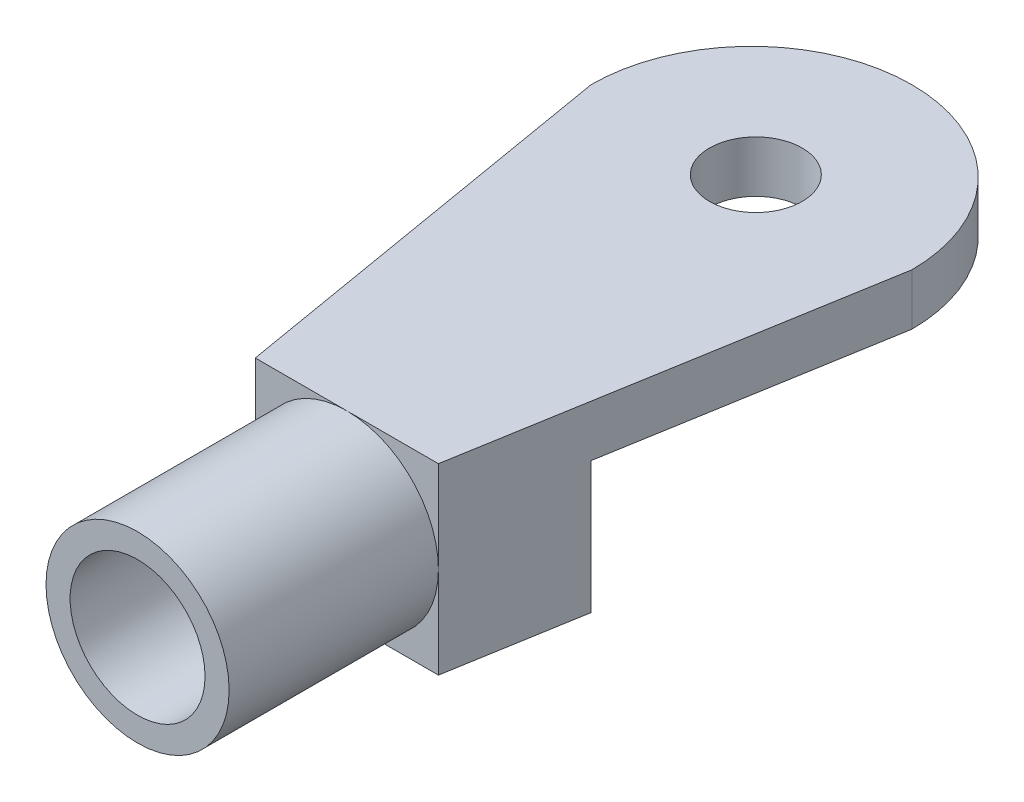
ISO-10303-21;
HEADER;
FILE_DESCRIPTION(('STEP AP214'),'2;1');
FILE_NAME('part.step','',(''),(''),'','','');
FILE_SCHEMA(('AUTOMOTIVE_DESIGN { 1 0 10303 214 1 1 1 1 }'));
ENDSEC;
DATA;
#1=APPLICATION_CONTEXT('core data for automotive mechanical design processes');
#2=APPLICATION_PROTOCOL_DEFINITION('international standard','automotive_design',2000,#1);
#3=PRODUCT_CONTEXT('',#1,'mechanical');
#4=PRODUCT('Part','Part','',(#3));
#5=PRODUCT_RELATED_PRODUCT_CATEGORY('part','',(#4));
#6=PRODUCT_DEFINITION_FORMATION('','',#4);
#7=PRODUCT_DEFINITION_CONTEXT('part definition',#1,'design');
#8=PRODUCT_DEFINITION('design','',#6,#7);
#9=PRODUCT_DEFINITION_SHAPE('','',#8);
#10=(LENGTH_UNIT() NAMED_UNIT(*) SI_UNIT(.MILLI.,.METRE.));
#11=(NAMED_UNIT(*) PLANE_ANGLE_UNIT() SI_UNIT($,.RADIAN.));
#12=(NAMED_UNIT(*) SI_UNIT($,.STERADIAN.) SOLID_ANGLE_UNIT());
#13=UNCERTAINTY_MEASURE_WITH_UNIT(LENGTH_MEASURE(1.E-05),#10,'distance_accuracy_value','');
#14=(GEOMETRIC_REPRESENTATION_CONTEXT(3) GLOBAL_UNCERTAINTY_ASSIGNED_CONTEXT((#13)) GLOBAL_UNIT_ASSIGNED_CONTEXT((#10,
#11,#12)) REPRESENTATION_CONTEXT('',''));
#15=CARTESIAN_POINT('',(0.,0.,0.));
#16=DIRECTION('',(0.,0.,1.));
#17=DIRECTION('',(1.,0.,0.));
#18=AXIS2_PLACEMENT_3D('',#15,#16,#17);
#19=CARTESIAN_POINT('',(4.445,-4.445,-25.4));
#20=DIRECTION('',(0.,1.,0.));
#21=DIRECTION('',(-1.,0.,0.));
#22=AXIS2_PLACEMENT_3D('',#19,#20,#21);
#23=PLANE('',#22);
#24=DIRECTION('',(1.,0.,0.));
#25=VECTOR('',#24,1.);
#26=CARTESIAN_POINT('',(0.,-4.445,-6.32905239312037));
#27=LINE('',#26,#25);
#28=CARTESIAN_POINT('',(-5.52122368393732,-4.445,-6.32905239312037));
#29=VERTEX_POINT('',#28);
#30=CARTESIAN_POINT('',(5.52122368393732,-4.445,-6.32905239312037));
#31=VERTEX_POINT('',#30);
#32=EDGE_CURVE('E117',#29,#31,#27,.T.);
#33=ORIENTED_EDGE('',*,*,#32,.T.);
#34=DIRECTION('',(-0.167638606293012,0.,0.985848516598842));
#35=VECTOR('',#34,1.);
#36=CARTESIAN_POINT('',(4.445,-4.445,0.));
#37=LINE('',#36,#35);
#38=CARTESIAN_POINT('',(4.445,-4.445,0.));
#39=VERTEX_POINT('',#38);
#40=EDGE_CURVE('E156',#31,#39,#37,.T.);
#41=ORIENTED_EDGE('',*,*,#40,.T.);
#42=DIRECTION('',(-1.,0.,0.));
#43=VECTOR('',#42,1.);
#44=CARTESIAN_POINT('',(4.445,-4.445,0.));
#45=LINE('',#44,#43);
#46=CARTESIAN_POINT('',(0.,-4.445,0.));
#47=VERTEX_POINT('',#46);
#48=EDGE_CURVE('E183',#39,#47,#45,.T.);
#49=ORIENTED_EDGE('',*,*,#48,.T.);
#50=CARTESIAN_POINT('',(-4.445,-4.445,0.));
#51=VERTEX_POINT('',#50);
#52=EDGE_CURVE('E182',#47,#51,#45,.T.);
#53=ORIENTED_EDGE('',*,*,#52,.T.);
#54=DIRECTION('',(-0.167638606293012,0.,-0.985848516598842));
#55=VECTOR('',#54,1.);
#56=CARTESIAN_POINT('',(-7.78494103413428,-4.445,-19.6415132936245));
#57=LINE('',#56,#55);
#58=EDGE_CURVE('E167',#51,#29,#57,.T.);
#59=ORIENTED_EDGE('',*,*,#58,.T.);
#60=EDGE_LOOP('',(#33,#41,#49,#53,#59));
#61=FACE_BOUND('',#60,.T.);
#62=ADVANCED_FACE('F45',(#61),#23,.F.);
#63=CARTESIAN_POINT('',(0.,35.9827809081811,-19.6415132936245));
#64=DIRECTION('',(0.,-1.,0.));
#65=DIRECTION('',(1.,0.,0.));
#66=AXIS2_PLACEMENT_3D('',#63,#64,#65);
#67=CYLINDRICAL_SURFACE('',#66,7.78494103413428);
#68=DIRECTION('',(0.,-1.,0.));
#69=VECTOR('',#68,1.);
#70=CARTESIAN_POINT('',(7.78494103413428,35.9827809081811,-19.6415132936245));
#71=LINE('',#70,#69);
#72=CARTESIAN_POINT('',(7.78494103413428,4.445,-19.6415132936245));
#73=VERTEX_POINT('',#72);
#74=CARTESIAN_POINT('',(7.78494103413428,1.94499992,-19.6415132936245));
#75=VERTEX_POINT('',#74);
#76=EDGE_CURVE('E170',#73,#75,#71,.T.);
#77=ORIENTED_EDGE('',*,*,#76,.T.);
#78=CARTESIAN_POINT('',(0.,1.94499992,-19.6415132936245));
#79=DIRECTION('',(0.,-1.,0.));
#80=DIRECTION('',(1.,0.,0.));
#81=AXIS2_PLACEMENT_3D('',#78,#79,#80);
#82=CIRCLE('',#81,7.78494103413428);
#83=CARTESIAN_POINT('',(-7.78494103413427,1.94499992,-19.6415132936245));
#84=VERTEX_POINT('',#83);
#85=EDGE_CURVE('E61',#84,#75,#82,.T.);
#86=ORIENTED_EDGE('',*,*,#85,.F.);
#87=DIRECTION('',(0.,-1.,0.));
#88=VECTOR('',#87,1.);
#89=CARTESIAN_POINT('',(-7.78494103413427,35.9827809081811,-19.6415132936245));
#90=LINE('',#89,#88);
#91=CARTESIAN_POINT('',(-7.78494103413427,4.445,-19.6415132936245));
#92=VERTEX_POINT('',#91);
#93=EDGE_CURVE('E137',#92,#84,#90,.T.);
#94=ORIENTED_EDGE('',*,*,#93,.F.);
#95=CARTESIAN_POINT('',(0.,4.445,-19.6415132936245));
#96=DIRECTION('',(0.,-1.,0.));
#97=DIRECTION('',(1.,0.,0.));
#98=AXIS2_PLACEMENT_3D('',#95,#96,#97);
#99=CIRCLE('',#98,7.78494103413428);
#100=EDGE_CURVE('E161',#73,#92,#99,.F.);
#101=ORIENTED_EDGE('',*,*,#100,.F.);
#102=EDGE_LOOP('',(#77,#86,#94,#101));
#103=FACE_BOUND('',#102,.T.);
#104=ADVANCED_FACE('F226',(#103),#67,.T.);
#105=CARTESIAN_POINT('',(-7.78494103413427,35.9827809081811,-19.6415132936245));
#106=DIRECTION('',(-0.985848516598842,0.,0.167638606293012));
#107=DIRECTION('',(0.167638606293012,0.,0.985848516598842));
#108=AXIS2_PLACEMENT_3D('',#105,#106,#107);
#109=PLANE('',#108);
#110=DIRECTION('',(-0.167638606293012,0.,-0.985848516598842));
#111=VECTOR('',#110,1.);
#112=CARTESIAN_POINT('',(-4.32008348818821,1.94499992,0.734608576100356));
#113=LINE('',#112,#111);
#114=CARTESIAN_POINT('',(-5.52122368393732,1.94499992,-6.32905239312037));
#115=VERTEX_POINT('',#114);
#116=EDGE_CURVE('E128',#115,#84,#113,.T.);
#117=ORIENTED_EDGE('',*,*,#116,.F.);
#118=DIRECTION('',(0.,-1.,0.));
#119=VECTOR('',#118,1.);
#120=CARTESIAN_POINT('',(-5.52122368393732,1.94499992,-6.32905239312037));
#121=LINE('',#120,#119);
#122=EDGE_CURVE('E112',#115,#29,#121,.T.);
#123=ORIENTED_EDGE('',*,*,#122,.T.);
#124=ORIENTED_EDGE('',*,*,#58,.F.);
#125=DIRECTION('',(0.,1.,0.));
#126=VECTOR('',#125,1.);
#127=CARTESIAN_POINT('',(-4.445,4.445,0.));
#128=LINE('',#127,#126);
#129=CARTESIAN_POINT('',(-4.445,0.,0.));
#130=VERTEX_POINT('',#129);
#131=EDGE_CURVE('E188',#51,#130,#128,.T.);
#132=ORIENTED_EDGE('',*,*,#131,.T.);
#133=CARTESIAN_POINT('',(-4.445,4.445,0.));
#134=VERTEX_POINT('',#133);
#135=EDGE_CURVE('E187',#130,#134,#128,.T.);
#136=ORIENTED_EDGE('',*,*,#135,.T.);
#137=DIRECTION('',(0.167638606293012,0.,0.985848516598842));
#138=VECTOR('',#137,1.);
#139=CARTESIAN_POINT('',(-7.78494103413427,4.445,-19.6415132936245));
#140=LINE('',#139,#138);
#141=EDGE_CURVE('E157',#92,#134,#140,.T.);
#142=ORIENTED_EDGE('',*,*,#141,.F.);
#143=ORIENTED_EDGE('',*,*,#93,.T.);
#144=EDGE_LOOP('',(#117,#123,#124,#132,#136,#142,#143));
#145=FACE_BOUND('',#144,.T.);
#146=ADVANCED_FACE('F134',(#145),#109,.T.);
#147=CARTESIAN_POINT('',(4.445,35.9827809081811,0.));
#148=DIRECTION('',(0.985848516598842,0.,0.167638606293012));
#149=DIRECTION('',(0.167638606293012,0.,-0.985848516598842));
#150=AXIS2_PLACEMENT_3D('',#147,#148,#149);
#151=PLANE('',#150);
#152=ORIENTED_EDGE('',*,*,#40,.F.);
#153=DIRECTION('',(0.,-1.,0.));
#154=VECTOR('',#153,1.);
#155=CARTESIAN_POINT('',(5.52122368393732,1.94499992,-6.32905239312037));
#156=LINE('',#155,#154);
#157=CARTESIAN_POINT('',(5.52122368393732,1.94499992,-6.32905239312037));
#158=VERTEX_POINT('',#157);
#159=EDGE_CURVE('E123',#158,#31,#156,.T.);
#160=ORIENTED_EDGE('',*,*,#159,.F.);
#161=DIRECTION('',(-0.167638606293012,0.,0.985848516598842));
#162=VECTOR('',#161,1.);
#163=CARTESIAN_POINT('',(4.32008348818821,1.94499992,0.734608576100356));
#164=LINE('',#163,#162);
#165=EDGE_CURVE('E129',#75,#158,#164,.T.);
#166=ORIENTED_EDGE('',*,*,#165,.F.);
#167=ORIENTED_EDGE('',*,*,#76,.F.);
#168=DIRECTION('',(0.167638606293012,0.,-0.985848516598842));
#169=VECTOR('',#168,1.);
#170=CARTESIAN_POINT('',(4.445,4.445,0.));
#171=LINE('',#170,#169);
#172=CARTESIAN_POINT('',(4.445,4.445,0.));
#173=VERTEX_POINT('',#172);
#174=EDGE_CURVE('E164',#173,#73,#171,.T.);
#175=ORIENTED_EDGE('',*,*,#174,.F.);
#176=DIRECTION('',(0.,-1.,0.));
#177=VECTOR('',#176,1.);
#178=CARTESIAN_POINT('',(4.445,4.445,0.));
#179=LINE('',#178,#177);
#180=CARTESIAN_POINT('',(4.445,0.,0.));
#181=VERTEX_POINT('',#180);
#182=EDGE_CURVE('E178',#173,#181,#179,.T.);
#183=ORIENTED_EDGE('',*,*,#182,.T.);
#184=EDGE_CURVE('E69',#181,#39,#179,.T.);
#185=ORIENTED_EDGE('',*,*,#184,.T.);
#186=EDGE_LOOP('',(#152,#160,#166,#167,#175,#183,#185));
#187=FACE_BOUND('',#186,.T.);
#188=ADVANCED_FACE('F239',(#187),#151,.T.);
#189=CARTESIAN_POINT('',(0.,-4.445,-19.8533461260434));
#190=DIRECTION('',(0.,1.,0.));
#191=DIRECTION('',(-1.,0.,0.));
#192=AXIS2_PLACEMENT_3D('',#189,#190,#191);
#193=CYLINDRICAL_SURFACE('',#192,2.2499955);
#194=CARTESIAN_POINT('',(0.,4.445,-19.8533461260434));
#195=DIRECTION('',(0.,1.,0.));
#196=DIRECTION('',(-1.,0.,0.));
#197=AXIS2_PLACEMENT_3D('',#194,#195,#196);
#198=CIRCLE('',#197,2.2499955);
#199=CARTESIAN_POINT('',(-2.2499955,4.445,-19.8533461260434));
#200=VERTEX_POINT('',#199);
#201=EDGE_CURVE('E151',#200,#200,#198,.T.);
#202=CARTESIAN_POINT('',(0.,1.94499992,-19.8533461260434));
#203=DIRECTION('',(0.,-1.,0.));
#204=DIRECTION('',(1.,0.,0.));
#205=AXIS2_PLACEMENT_3D('',#202,#203,#204);
#206=CIRCLE('',#205,2.2499955);
#207=CARTESIAN_POINT('',(-2.2499955,1.94499992,-19.8533461260434));
#208=VERTEX_POINT('',#207);
#209=EDGE_CURVE('E124',#208,#208,#206,.F.);
#210=CARTESIAN_POINT('',(-2.2499955,4.445,-19.8533461260434));
#211=CARTESIAN_POINT('',(-2.2499955,4.4189583325,-19.8533461260434));
#212=CARTESIAN_POINT('',(-2.2499955,4.392916665,-19.8533461260434));
#213=CARTESIAN_POINT('',(-2.2499955,4.34083333,-19.8533461260434));
#214=CARTESIAN_POINT('',(-2.2499955,4.3147916625,-19.8533461260434));
#215=CARTESIAN_POINT('',(-2.2499955,4.2627083275,-19.8533461260434));
#216=CARTESIAN_POINT('',(-2.2499955,4.23666666,-19.8533461260434));
#217=CARTESIAN_POINT('',(-2.2499955,4.184583325,-19.8533461260434));
#218=CARTESIAN_POINT('',(-2.2499955,4.1585416575,-19.8533461260434));
#219=CARTESIAN_POINT('',(-2.2499955,4.1064583225,-19.8533461260434));
#220=CARTESIAN_POINT('',(-2.2499955,4.080416655,-19.8533461260434));
#221=CARTESIAN_POINT('',(-2.2499955,4.02833332,-19.8533461260434));
#222=CARTESIAN_POINT('',(-2.2499955,4.0022916525,-19.8533461260434));
#223=CARTESIAN_POINT('',(-2.2499955,3.9502083175,-19.8533461260434));
#224=CARTESIAN_POINT('',(-2.2499955,3.92416665,-19.8533461260434));
#225=CARTESIAN_POINT('',(-2.2499955,3.872083315,-19.8533461260434));
#226=CARTESIAN_POINT('',(-2.2499955,3.8460416475,-19.8533461260434));
#227=CARTESIAN_POINT('',(-2.2499955,3.7939583125,-19.8533461260434));
#228=CARTESIAN_POINT('',(-2.2499955,3.767916645,-19.8533461260434));
#229=CARTESIAN_POINT('',(-2.2499955,3.71583331,-19.8533461260434));
#230=CARTESIAN_POINT('',(-2.2499955,3.6897916425,-19.8533461260434));
#231=CARTESIAN_POINT('',(-2.2499955,3.6377083075,-19.8533461260434));
#232=CARTESIAN_POINT('',(-2.2499955,3.61166664,-19.8533461260434));
#233=CARTESIAN_POINT('',(-2.2499955,3.559583305,-19.8533461260434));
#234=CARTESIAN_POINT('',(-2.2499955,3.5335416375,-19.8533461260434));
#235=CARTESIAN_POINT('',(-2.2499955,3.4814583025,-19.8533461260434));
#236=CARTESIAN_POINT('',(-2.2499955,3.455416635,-19.8533461260434));
#237=CARTESIAN_POINT('',(-2.2499955,3.4033333,-19.8533461260434));
#238=CARTESIAN_POINT('',(-2.2499955,3.3772916325,-19.8533461260434));
#239=CARTESIAN_POINT('',(-2.2499955,3.3252082975,-19.8533461260434));
#240=CARTESIAN_POINT('',(-2.2499955,3.29916663,-19.8533461260434));
#241=CARTESIAN_POINT('',(-2.2499955,3.247083295,-19.8533461260434));
#242=CARTESIAN_POINT('',(-2.2499955,3.2210416275,-19.8533461260434));
#243=CARTESIAN_POINT('',(-2.2499955,3.1689582925,-19.8533461260434));
#244=CARTESIAN_POINT('',(-2.2499955,3.142916625,-19.8533461260434));
#245=CARTESIAN_POINT('',(-2.2499955,3.09083329,-19.8533461260434));
#246=CARTESIAN_POINT('',(-2.2499955,3.0647916225,-19.8533461260434));
#247=CARTESIAN_POINT('',(-2.2499955,3.0127082875,-19.8533461260434));
#248=CARTESIAN_POINT('',(-2.2499955,2.98666662,-19.8533461260434));
#249=CARTESIAN_POINT('',(-2.2499955,2.934583285,-19.8533461260434));
#250=CARTESIAN_POINT('',(-2.2499955,2.9085416175,-19.8533461260434));
#251=CARTESIAN_POINT('',(-2.2499955,2.8564582825,-19.8533461260434));
#252=CARTESIAN_POINT('',(-2.2499955,2.830416615,-19.8533461260434));
#253=CARTESIAN_POINT('',(-2.2499955,2.77833328,-19.8533461260434));
#254=CARTESIAN_POINT('',(-2.2499955,2.7522916125,-19.8533461260434));
#255=CARTESIAN_POINT('',(-2.2499955,2.7002082775,-19.8533461260434));
#256=CARTESIAN_POINT('',(-2.2499955,2.67416661,-19.8533461260434));
#257=CARTESIAN_POINT('',(-2.2499955,2.622083275,-19.8533461260434));
#258=CARTESIAN_POINT('',(-2.2499955,2.5960416075,-19.8533461260434));
#259=CARTESIAN_POINT('',(-2.2499955,2.5439582725,-19.8533461260434));
#260=CARTESIAN_POINT('',(-2.2499955,2.517916605,-19.8533461260434));
#261=CARTESIAN_POINT('',(-2.2499955,2.46583327,-19.8533461260434));
#262=CARTESIAN_POINT('',(-2.2499955,2.4397916025,-19.8533461260434));
#263=CARTESIAN_POINT('',(-2.2499955,2.3877082675,-19.8533461260434));
#264=CARTESIAN_POINT('',(-2.2499955,2.3616666,-19.8533461260434));
#265=CARTESIAN_POINT('',(-2.2499955,2.309583265,-19.8533461260434));
#266=CARTESIAN_POINT('',(-2.2499955,2.2835415975,-19.8533461260434));
#267=CARTESIAN_POINT('',(-2.2499955,2.2314582625,-19.8533461260434));
#268=CARTESIAN_POINT('',(-2.2499955,2.205416595,-19.8533461260434));
#269=CARTESIAN_POINT('',(-2.2499955,2.15333326,-19.8533461260434));
#270=CARTESIAN_POINT('',(-2.2499955,2.1272915925,-19.8533461260434));
#271=CARTESIAN_POINT('',(-2.2499955,2.0752082575,-19.8533461260434));
#272=CARTESIAN_POINT('',(-2.2499955,2.04916659,-19.8533461260434));
#273=CARTESIAN_POINT('',(-2.2499955,1.997083255,-19.8533461260434));
#274=CARTESIAN_POINT('',(-2.2499955,1.9710415875,-19.8533461260434));
#275=CARTESIAN_POINT('',(-2.2499955,1.94499992,-19.8533461260434));
#276=B_SPLINE_CURVE_WITH_KNOTS('',3,(#210,#211,#212,#213,#214,#215,#216,#217,#218,#219,#220,
#221,#222,#223,#224,#225,#226,#227,#228,#229,#230,#231,#232,#233,#234,#235,#236,#237,#238,#239,
#240,#241,#242,#243,#244,#245,#246,#247,#248,#249,#250,#251,#252,#253,#254,#255,#256,#257,#258,
#259,#260,#261,#262,#263,#264,#265,#266,#267,#268,#269,#270,#271,#272,#273,#274,#275),
.UNSPECIFIED.,.F.,.F.,(4,2,2,2,2,2,2,2,2,2,2,2,2,2,2,2,2,2,2,2,2,2,2,2,2,2,2,2,2,2,2,2,4),(0.,
0.0781250025000003,0.156250005000001,0.234375007500001,0.312500009999999,0.3906250125,
0.468750015,0.5468750175,0.62500002,0.703125022500001,0.781250024999999,0.8593750275,0.93750003,
1.0156250325,1.093750035,1.1718750375,1.25000004,1.3281250425,1.406250045,1.4843750475,
1.56250005,1.6406250525,1.718750055,1.7968750575,1.87500006,1.9531250625,2.031250065,
2.1093750675,2.18750007,2.2656250725,2.343750075,2.4218750775,2.50000008),.UNSPECIFIED.);
#277=EDGE_CURVE('BSEAM242',#200,#208,#276,.T.);
#278=ORIENTED_EDGE('',*,*,#201,.T.);
#279=ORIENTED_EDGE('',*,*,#209,.F.);
#280=ORIENTED_EDGE('',*,*,#277,.T.);
#281=ORIENTED_EDGE('',*,*,#277,.F.);
#282=EDGE_LOOP('',(#278,#280,#279,#281));
#283=FACE_BOUND('',#282,.T.);
#284=ADVANCED_FACE('F242',(#283),#193,.F.);
#285=CARTESIAN_POINT('',(0.,0.,10.16));
#286=DIRECTION('',(0.,0.,1.));
#287=DIRECTION('',(1.,0.,0.));
#288=AXIS2_PLACEMENT_3D('',#285,#286,#287);
#289=PLANE('',#288);
#290=CARTESIAN_POINT('',(0.,0.,10.16));
#291=DIRECTION('',(0.,0.,1.));
#292=DIRECTION('',(1.,0.,0.));
#293=AXIS2_PLACEMENT_3D('',#290,#291,#292);
#294=CIRCLE('',#293,4.445);
#295=CARTESIAN_POINT('',(4.445,0.,10.16));
#296=VERTEX_POINT('',#295);
#297=EDGE_CURVE('E11',#296,#296,#294,.T.);
#298=ORIENTED_EDGE('',*,*,#297,.T.);
#299=EDGE_LOOP('',(#298));
#300=FACE_BOUND('',#299,.T.);
#301=CARTESIAN_POINT('',(0.,0.,10.16));
#302=DIRECTION('',(0.,0.,1.));
#303=DIRECTION('',(1.,0.,0.));
#304=AXIS2_PLACEMENT_3D('',#301,#302,#303);
#305=CIRCLE('',#304,3.2750000032);
#306=CARTESIAN_POINT('',(3.2750000032,0.,10.16));
#307=VERTEX_POINT('',#306);
#308=EDGE_CURVE('E198',#307,#307,#305,.T.);
#309=ORIENTED_EDGE('',*,*,#308,.F.);
#310=EDGE_LOOP('',(#309));
#311=FACE_BOUND('',#310,.T.);
#312=ADVANCED_FACE('F222',(#300,#311),#289,.T.);
#313=CARTESIAN_POINT('',(0.,0.,10.16));
#314=DIRECTION('',(0.,0.,-1.));
#315=DIRECTION('',(-1.,0.,0.));
#316=AXIS2_PLACEMENT_3D('',#313,#314,#315);
#317=CYLINDRICAL_SURFACE('',#316,4.445);
#318=ORIENTED_EDGE('',*,*,#297,.F.);
#319=EDGE_LOOP('',(#318));
#320=FACE_BOUND('',#319,.T.);
#321=CARTESIAN_POINT('',(0.,0.,0.));
#322=DIRECTION('',(0.,0.,1.));
#323=DIRECTION('',(1.,0.,0.));
#324=AXIS2_PLACEMENT_3D('',#321,#322,#323);
#325=CIRCLE('',#324,4.445);
#326=CARTESIAN_POINT('',(0.,4.445,0.));
#327=VERTEX_POINT('',#326);
#328=EDGE_CURVE('E49',#181,#327,#325,.T.);
#329=ORIENTED_EDGE('',*,*,#328,.T.);
#330=EDGE_CURVE('E362',#327,#130,#325,.T.);
#331=ORIENTED_EDGE('',*,*,#330,.T.);
#332=EDGE_CURVE('E367',#130,#47,#325,.T.);
#333=ORIENTED_EDGE('',*,*,#332,.T.);
#334=EDGE_CURVE('E202',#47,#181,#325,.T.);
#335=ORIENTED_EDGE('',*,*,#334,.T.);
#336=EDGE_LOOP('',(#329,#331,#333,#335));
#337=FACE_BOUND('',#336,.T.);
#338=ADVANCED_FACE('F47',(#320,#337),#317,.T.);
#339=CARTESIAN_POINT('',(0.,0.,10.16));
#340=DIRECTION('',(0.,0.,-1.));
#341=DIRECTION('',(-1.,0.,0.));
#342=AXIS2_PLACEMENT_3D('',#339,#340,#341);
#343=CYLINDRICAL_SURFACE('',#342,3.2750000032);
#344=ORIENTED_EDGE('',*,*,#308,.T.);
#345=EDGE_LOOP('',(#344));
#346=FACE_BOUND('',#345,.T.);
#347=CARTESIAN_POINT('',(0.,0.,0.));
#348=DIRECTION('',(0.,0.,1.));
#349=DIRECTION('',(1.,0.,0.));
#350=AXIS2_PLACEMENT_3D('',#347,#348,#349);
#351=CIRCLE('',#350,3.2750000032);
#352=CARTESIAN_POINT('',(3.2750000032,0.,0.));
#353=VERTEX_POINT('',#352);
#354=EDGE_CURVE('E197',#353,#353,#351,.T.);
#355=ORIENTED_EDGE('',*,*,#354,.F.);
#356=EDGE_LOOP('',(#355));
#357=FACE_BOUND('',#356,.T.);
#358=ADVANCED_FACE('F209',(#346,#357),#343,.F.);
#359=CARTESIAN_POINT('',(0.,0.,0.));
#360=DIRECTION('',(0.,0.,-1.));
#361=DIRECTION('',(-1.,0.,0.));
#362=AXIS2_PLACEMENT_3D('',#359,#360,#361);
#363=PLANE('',#362);
#364=ORIENTED_EDGE('',*,*,#354,.T.);
#365=EDGE_LOOP('',(#364));
#366=FACE_BOUND('',#365,.T.);
#367=ADVANCED_FACE('F207',(#366),#363,.F.);
#368=ORIENTED_EDGE('',*,*,#328,.F.);
#369=ORIENTED_EDGE('',*,*,#182,.F.);
#370=DIRECTION('',(1.,0.,0.));
#371=VECTOR('',#370,1.);
#372=CARTESIAN_POINT('',(4.445,4.445,0.));
#373=LINE('',#372,#371);
#374=EDGE_CURVE('E192',#327,#173,#373,.T.);
#375=ORIENTED_EDGE('',*,*,#374,.F.);
#376=EDGE_LOOP('',(#368,#369,#375));
#377=FACE_BOUND('',#376,.T.);
#378=ADVANCED_FACE('F217',(#377),#363,.F.);
#379=ORIENTED_EDGE('',*,*,#330,.F.);
#380=EDGE_CURVE('E193',#134,#327,#373,.T.);
#381=ORIENTED_EDGE('',*,*,#380,.F.);
#382=ORIENTED_EDGE('',*,*,#135,.F.);
#383=EDGE_LOOP('',(#379,#381,#382));
#384=FACE_BOUND('',#383,.T.);
#385=ADVANCED_FACE('F313',(#384),#363,.F.);
#386=ORIENTED_EDGE('',*,*,#332,.F.);
#387=ORIENTED_EDGE('',*,*,#131,.F.);
#388=ORIENTED_EDGE('',*,*,#52,.F.);
#389=EDGE_LOOP('',(#386,#387,#388));
#390=FACE_BOUND('',#389,.T.);
#391=ADVANCED_FACE('F220',(#390),#363,.F.);
#392=CARTESIAN_POINT('',(4.445,4.445,-25.4));
#393=DIRECTION('',(0.,-1.,0.));
#394=DIRECTION('',(1.,0.,0.));
#395=AXIS2_PLACEMENT_3D('',#392,#393,#394);
#396=PLANE('',#395);
#397=ORIENTED_EDGE('',*,*,#201,.F.);
#398=EDGE_LOOP('',(#397));
#399=FACE_BOUND('',#398,.T.);
#400=ORIENTED_EDGE('',*,*,#374,.T.);
#401=ORIENTED_EDGE('',*,*,#174,.T.);
#402=ORIENTED_EDGE('',*,*,#100,.T.);
#403=ORIENTED_EDGE('',*,*,#141,.T.);
#404=ORIENTED_EDGE('',*,*,#380,.T.);
#405=EDGE_LOOP('',(#400,#401,#402,#403,#404));
#406=FACE_BOUND('',#405,.T.);
#407=ADVANCED_FACE('F235',(#399,#406),#396,.F.);
#408=ORIENTED_EDGE('',*,*,#334,.F.);
#409=ORIENTED_EDGE('',*,*,#48,.F.);
#410=ORIENTED_EDGE('',*,*,#184,.F.);
#411=EDGE_LOOP('',(#408,#409,#410));
#412=FACE_BOUND('',#411,.T.);
#413=ADVANCED_FACE('F219',(#412),#363,.F.);
#414=CARTESIAN_POINT('',(0.,1.94499992,-6.32905239312037));
#415=DIRECTION('',(0.,0.,-1.));
#416=DIRECTION('',(-1.,0.,0.));
#417=AXIS2_PLACEMENT_3D('',#414,#415,#416);
#418=PLANE('',#417);
#419=ORIENTED_EDGE('',*,*,#32,.F.);
#420=ORIENTED_EDGE('',*,*,#122,.F.);
#421=DIRECTION('',(1.,0.,0.));
#422=VECTOR('',#421,1.);
#423=CARTESIAN_POINT('',(0.,1.94499992,-6.32905239312037));
#424=LINE('',#423,#422);
#425=EDGE_CURVE('E115',#115,#158,#424,.T.);
#426=ORIENTED_EDGE('',*,*,#425,.T.);
#427=ORIENTED_EDGE('',*,*,#159,.T.);
#428=EDGE_LOOP('',(#419,#420,#426,#427));
#429=FACE_BOUND('',#428,.T.);
#430=ADVANCED_FACE('F114',(#429),#418,.T.);
#431=CARTESIAN_POINT('',(0.,1.94499992,0.));
#432=DIRECTION('',(0.,-1.,0.));
#433=DIRECTION('',(1.,0.,0.));
#434=AXIS2_PLACEMENT_3D('',#431,#432,#433);
#435=PLANE('',#434);
#436=ORIENTED_EDGE('',*,*,#425,.F.);
#437=ORIENTED_EDGE('',*,*,#116,.T.);
#438=ORIENTED_EDGE('',*,*,#85,.T.);
#439=ORIENTED_EDGE('',*,*,#165,.T.);
#440=EDGE_LOOP('',(#436,#437,#438,#439));
#441=FACE_BOUND('',#440,.T.);
#442=ORIENTED_EDGE('',*,*,#209,.T.);
#443=EDGE_LOOP('',(#442));
#444=FACE_BOUND('',#443,.T.);
#445=ADVANCED_FACE('F126',(#441,#444),#435,.T.);
#446=CLOSED_SHELL('',(#62,#104,#146,#188,#284,#312,#338,#358,#367,#378,#385,#391,#407,#413,#430,#445));
#447=MANIFOLD_SOLID_BREP('B2',#446);
#448=ADVANCED_BREP_SHAPE_REPRESENTATION('',(#18,#447),#14);
#449=SHAPE_DEFINITION_REPRESENTATION(#9,#448);
ENDSEC;
END-ISO-10303-21;
